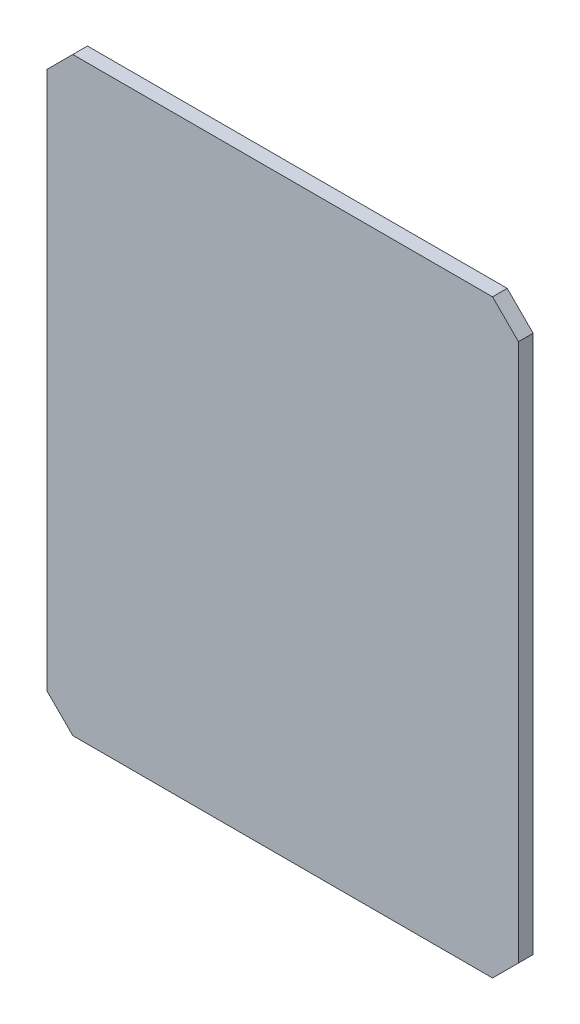
ISO-10303-21;
HEADER;
FILE_DESCRIPTION(('STEP AP214'),'2;1');
FILE_NAME('part.step','',(''),(''),'','','');
FILE_SCHEMA(('AUTOMOTIVE_DESIGN { 1 0 10303 214 1 1 1 1 }'));
ENDSEC;
DATA;
#1=APPLICATION_CONTEXT('core data for automotive mechanical design processes');
#2=APPLICATION_PROTOCOL_DEFINITION('international standard','automotive_design',2000,#1);
#3=PRODUCT_CONTEXT('',#1,'mechanical');
#4=PRODUCT('Part','Part','',(#3));
#5=PRODUCT_RELATED_PRODUCT_CATEGORY('part','',(#4));
#6=PRODUCT_DEFINITION_FORMATION('','',#4);
#7=PRODUCT_DEFINITION_CONTEXT('part definition',#1,'design');
#8=PRODUCT_DEFINITION('design','',#6,#7);
#9=PRODUCT_DEFINITION_SHAPE('','',#8);
#10=(LENGTH_UNIT() NAMED_UNIT(*) SI_UNIT(.MILLI.,.METRE.));
#11=(NAMED_UNIT(*) PLANE_ANGLE_UNIT() SI_UNIT($,.RADIAN.));
#12=(NAMED_UNIT(*) SI_UNIT($,.STERADIAN.) SOLID_ANGLE_UNIT());
#13=UNCERTAINTY_MEASURE_WITH_UNIT(LENGTH_MEASURE(1.E-05),#10,'distance_accuracy_value','');
#14=(GEOMETRIC_REPRESENTATION_CONTEXT(3) GLOBAL_UNCERTAINTY_ASSIGNED_CONTEXT((#13)) GLOBAL_UNIT_ASSIGNED_CONTEXT((#10,
#11,#12)) REPRESENTATION_CONTEXT('',''));
#15=CARTESIAN_POINT('',(0.,0.,0.));
#16=DIRECTION('',(0.,0.,1.));
#17=DIRECTION('',(1.,0.,0.));
#18=AXIS2_PLACEMENT_3D('',#15,#16,#17);
#19=CARTESIAN_POINT('',(273.,30.,17.));
#20=DIRECTION('',(-1.,0.,0.));
#21=DIRECTION('',(0.,0.,1.));
#22=AXIS2_PLACEMENT_3D('',#19,#20,#21);
#23=PLANE('',#22);
#24=DIRECTION('',(0.,1.,0.));
#25=VECTOR('',#24,1.);
#26=CARTESIAN_POINT('',(273.,30.,0.));
#27=LINE('',#26,#25);
#28=CARTESIAN_POINT('',(273.,60.,0.));
#29=VERTEX_POINT('',#28);
#30=CARTESIAN_POINT('',(273.,683.,0.));
#31=VERTEX_POINT('',#30);
#32=EDGE_CURVE('E112',#29,#31,#27,.T.);
#33=ORIENTED_EDGE('',*,*,#32,.T.);
#34=DIRECTION('',(0.,0.,1.));
#35=VECTOR('',#34,1.);
#36=CARTESIAN_POINT('',(273.,683.,17.));
#37=LINE('',#36,#35);
#38=CARTESIAN_POINT('',(273.,683.,17.));
#39=VERTEX_POINT('',#38);
#40=EDGE_CURVE('E135',#31,#39,#37,.T.);
#41=ORIENTED_EDGE('',*,*,#40,.T.);
#42=DIRECTION('',(0.,1.,0.));
#43=VECTOR('',#42,1.);
#44=CARTESIAN_POINT('',(273.,30.,17.));
#45=LINE('',#44,#43);
#46=CARTESIAN_POINT('',(273.,60.,17.));
#47=VERTEX_POINT('',#46);
#48=EDGE_CURVE('E110',#47,#39,#45,.T.);
#49=ORIENTED_EDGE('',*,*,#48,.F.);
#50=DIRECTION('',(0.,0.,-1.));
#51=VECTOR('',#50,1.);
#52=CARTESIAN_POINT('',(273.,60.,17.));
#53=LINE('',#52,#51);
#54=EDGE_CURVE('E132',#47,#29,#53,.T.);
#55=ORIENTED_EDGE('',*,*,#54,.T.);
#56=EDGE_LOOP('',(#33,#41,#49,#55));
#57=FACE_BOUND('',#56,.T.);
#58=ADVANCED_FACE('F17',(#57),#23,.F.);
#59=CARTESIAN_POINT('',(273.,713.,17.));
#60=DIRECTION('',(0.,-1.,0.));
#61=DIRECTION('',(1.,0.,0.));
#62=AXIS2_PLACEMENT_3D('',#59,#60,#61);
#63=PLANE('',#62);
#64=DIRECTION('',(-1.,0.,0.));
#65=VECTOR('',#64,1.);
#66=CARTESIAN_POINT('',(273.,713.,0.));
#67=LINE('',#66,#65);
#68=CARTESIAN_POINT('',(243.,713.,0.));
#69=VERTEX_POINT('',#68);
#70=CARTESIAN_POINT('',(-243.,713.,0.));
#71=VERTEX_POINT('',#70);
#72=EDGE_CURVE('E108',#69,#71,#67,.T.);
#73=ORIENTED_EDGE('',*,*,#72,.T.);
#74=DIRECTION('',(0.,0.,1.));
#75=VECTOR('',#74,1.);
#76=CARTESIAN_POINT('',(-243.,713.,17.));
#77=LINE('',#76,#75);
#78=CARTESIAN_POINT('',(-243.,713.,17.));
#79=VERTEX_POINT('',#78);
#80=EDGE_CURVE('E87',#71,#79,#77,.T.);
#81=ORIENTED_EDGE('',*,*,#80,.T.);
#82=DIRECTION('',(-1.,0.,0.));
#83=VECTOR('',#82,1.);
#84=CARTESIAN_POINT('',(273.,713.,17.));
#85=LINE('',#84,#83);
#86=CARTESIAN_POINT('',(243.,713.,17.));
#87=VERTEX_POINT('',#86);
#88=EDGE_CURVE('E151',#87,#79,#85,.T.);
#89=ORIENTED_EDGE('',*,*,#88,.F.);
#90=DIRECTION('',(0.,0.,-1.));
#91=VECTOR('',#90,1.);
#92=CARTESIAN_POINT('',(243.,713.,17.));
#93=LINE('',#92,#91);
#94=EDGE_CURVE('E92',#87,#69,#93,.T.);
#95=ORIENTED_EDGE('',*,*,#94,.T.);
#96=EDGE_LOOP('',(#73,#81,#89,#95));
#97=FACE_BOUND('',#96,.T.);
#98=ADVANCED_FACE('F170',(#97),#63,.F.);
#99=CARTESIAN_POINT('',(-273.,30.,17.));
#100=DIRECTION('',(1.,0.,0.));
#101=DIRECTION('',(0.,0.,-1.));
#102=AXIS2_PLACEMENT_3D('',#99,#100,#101);
#103=PLANE('',#102);
#104=DIRECTION('',(0.,-1.,0.));
#105=VECTOR('',#104,1.);
#106=CARTESIAN_POINT('',(-273.,30.,17.));
#107=LINE('',#106,#105);
#108=CARTESIAN_POINT('',(-273.,683.,17.));
#109=VERTEX_POINT('',#108);
#110=CARTESIAN_POINT('',(-273.,60.,17.));
#111=VERTEX_POINT('',#110);
#112=EDGE_CURVE('E101',#109,#111,#107,.T.);
#113=ORIENTED_EDGE('',*,*,#112,.F.);
#114=DIRECTION('',(0.,0.,-1.));
#115=VECTOR('',#114,1.);
#116=CARTESIAN_POINT('',(-273.,683.,17.));
#117=LINE('',#116,#115);
#118=CARTESIAN_POINT('',(-273.,683.,0.));
#119=VERTEX_POINT('',#118);
#120=EDGE_CURVE('E86',#109,#119,#117,.T.);
#121=ORIENTED_EDGE('',*,*,#120,.T.);
#122=DIRECTION('',(0.,-1.,0.));
#123=VECTOR('',#122,1.);
#124=CARTESIAN_POINT('',(-273.,30.,0.));
#125=LINE('',#124,#123);
#126=CARTESIAN_POINT('',(-273.,60.,0.));
#127=VERTEX_POINT('',#126);
#128=EDGE_CURVE('E99',#119,#127,#125,.T.);
#129=ORIENTED_EDGE('',*,*,#128,.T.);
#130=DIRECTION('',(0.,0.,1.));
#131=VECTOR('',#130,1.);
#132=CARTESIAN_POINT('',(-273.,60.,17.));
#133=LINE('',#132,#131);
#134=EDGE_CURVE('E103',#127,#111,#133,.T.);
#135=ORIENTED_EDGE('',*,*,#134,.T.);
#136=EDGE_LOOP('',(#113,#121,#129,#135));
#137=FACE_BOUND('',#136,.T.);
#138=ADVANCED_FACE('F98',(#137),#103,.F.);
#139=CARTESIAN_POINT('',(273.,30.,17.));
#140=DIRECTION('',(0.,1.,0.));
#141=DIRECTION('',(-1.,0.,0.));
#142=AXIS2_PLACEMENT_3D('',#139,#140,#141);
#143=PLANE('',#142);
#144=DIRECTION('',(1.,0.,0.));
#145=VECTOR('',#144,1.);
#146=CARTESIAN_POINT('',(273.,30.,0.));
#147=LINE('',#146,#145);
#148=CARTESIAN_POINT('',(-243.,30.,0.));
#149=VERTEX_POINT('',#148);
#150=CARTESIAN_POINT('',(243.,30.,0.));
#151=VERTEX_POINT('',#150);
#152=EDGE_CURVE('E107',#149,#151,#147,.T.);
#153=ORIENTED_EDGE('',*,*,#152,.T.);
#154=DIRECTION('',(0.,0.,1.));
#155=VECTOR('',#154,1.);
#156=CARTESIAN_POINT('',(243.,30.,17.));
#157=LINE('',#156,#155);
#158=CARTESIAN_POINT('',(243.,30.,17.));
#159=VERTEX_POINT('',#158);
#160=EDGE_CURVE('E11',#151,#159,#157,.T.);
#161=ORIENTED_EDGE('',*,*,#160,.T.);
#162=DIRECTION('',(1.,0.,0.));
#163=VECTOR('',#162,1.);
#164=CARTESIAN_POINT('',(273.,30.,17.));
#165=LINE('',#164,#163);
#166=CARTESIAN_POINT('',(-243.,30.,17.));
#167=VERTEX_POINT('',#166);
#168=EDGE_CURVE('E116',#167,#159,#165,.T.);
#169=ORIENTED_EDGE('',*,*,#168,.F.);
#170=DIRECTION('',(0.,0.,-1.));
#171=VECTOR('',#170,1.);
#172=CARTESIAN_POINT('',(-243.,30.,17.));
#173=LINE('',#172,#171);
#174=EDGE_CURVE('E25',#167,#149,#173,.T.);
#175=ORIENTED_EDGE('',*,*,#174,.T.);
#176=EDGE_LOOP('',(#153,#161,#169,#175));
#177=FACE_BOUND('',#176,.T.);
#178=ADVANCED_FACE('F138',(#177),#143,.F.);
#179=CARTESIAN_POINT('',(0.,0.,17.));
#180=DIRECTION('',(0.,0.,1.));
#181=DIRECTION('',(1.,0.,0.));
#182=AXIS2_PLACEMENT_3D('',#179,#180,#181);
#183=PLANE('',#182);
#184=ORIENTED_EDGE('',*,*,#88,.T.);
#185=DIRECTION('',(0.707106781186549,0.707106781186546,0.));
#186=VECTOR('',#185,1.);
#187=CARTESIAN_POINT('',(-478.,478.,17.));
#188=LINE('',#187,#186);
#189=EDGE_CURVE('E130',#79,#109,#188,.F.);
#190=ORIENTED_EDGE('',*,*,#189,.T.);
#191=ORIENTED_EDGE('',*,*,#112,.T.);
#192=DIRECTION('',(-0.707106781186546,0.707106781186549,0.));
#193=VECTOR('',#192,1.);
#194=CARTESIAN_POINT('',(-106.5,-106.5,17.));
#195=LINE('',#194,#193);
#196=EDGE_CURVE('E37',#111,#167,#195,.F.);
#197=ORIENTED_EDGE('',*,*,#196,.T.);
#198=ORIENTED_EDGE('',*,*,#168,.T.);
#199=DIRECTION('',(-0.707106781186549,-0.707106781186546,0.));
#200=VECTOR('',#199,1.);
#201=CARTESIAN_POINT('',(106.5,-106.5,17.));
#202=LINE('',#201,#200);
#203=EDGE_CURVE('E126',#159,#47,#202,.F.);
#204=ORIENTED_EDGE('',*,*,#203,.T.);
#205=ORIENTED_EDGE('',*,*,#48,.T.);
#206=DIRECTION('',(0.707106781186548,-0.707106781186548,0.));
#207=VECTOR('',#206,1.);
#208=CARTESIAN_POINT('',(478.,478.,17.));
#209=LINE('',#208,#207);
#210=EDGE_CURVE('E128',#39,#87,#209,.F.);
#211=ORIENTED_EDGE('',*,*,#210,.T.);
#212=EDGE_LOOP('',(#184,#190,#191,#197,#198,#204,#205,#211));
#213=FACE_BOUND('',#212,.T.);
#214=ADVANCED_FACE('F157',(#213),#183,.T.);
#215=CARTESIAN_POINT('',(0.,0.,0.));
#216=DIRECTION('',(0.,0.,1.));
#217=DIRECTION('',(1.,0.,0.));
#218=AXIS2_PLACEMENT_3D('',#215,#216,#217);
#219=PLANE('',#218);
#220=ORIENTED_EDGE('',*,*,#128,.F.);
#221=DIRECTION('',(-0.707106781186549,-0.707106781186546,0.));
#222=VECTOR('',#221,1.);
#223=CARTESIAN_POINT('',(-273.,683.,0.));
#224=LINE('',#223,#222);
#225=EDGE_CURVE('E82',#119,#71,#224,.F.);
#226=ORIENTED_EDGE('',*,*,#225,.T.);
#227=ORIENTED_EDGE('',*,*,#72,.F.);
#228=DIRECTION('',(-0.707106781186548,0.707106781186548,0.));
#229=VECTOR('',#228,1.);
#230=CARTESIAN_POINT('',(243.,713.,0.));
#231=LINE('',#230,#229);
#232=EDGE_CURVE('E93',#69,#31,#231,.F.);
#233=ORIENTED_EDGE('',*,*,#232,.T.);
#234=ORIENTED_EDGE('',*,*,#32,.F.);
#235=DIRECTION('',(0.707106781186549,0.707106781186546,0.));
#236=VECTOR('',#235,1.);
#237=CARTESIAN_POINT('',(273.,60.,0.));
#238=LINE('',#237,#236);
#239=EDGE_CURVE('E119',#29,#151,#238,.F.);
#240=ORIENTED_EDGE('',*,*,#239,.T.);
#241=ORIENTED_EDGE('',*,*,#152,.F.);
#242=DIRECTION('',(0.707106781186546,-0.707106781186549,0.));
#243=VECTOR('',#242,1.);
#244=CARTESIAN_POINT('',(-243.,30.,0.));
#245=LINE('',#244,#243);
#246=EDGE_CURVE('E102',#149,#127,#245,.F.);
#247=ORIENTED_EDGE('',*,*,#246,.T.);
#248=EDGE_LOOP('',(#220,#226,#227,#233,#234,#240,#241,#247));
#249=FACE_BOUND('',#248,.T.);
#250=ADVANCED_FACE('F105',(#249),#219,.F.);
#251=CARTESIAN_POINT('',(-273.,683.,17.));
#252=DIRECTION('',(0.707106781186546,-0.707106781186549,0.));
#253=DIRECTION('',(0.,0.,-1.));
#254=AXIS2_PLACEMENT_3D('',#251,#252,#253);
#255=PLANE('',#254);
#256=ORIENTED_EDGE('',*,*,#189,.F.);
#257=ORIENTED_EDGE('',*,*,#80,.F.);
#258=ORIENTED_EDGE('',*,*,#225,.F.);
#259=ORIENTED_EDGE('',*,*,#120,.F.);
#260=EDGE_LOOP('',(#256,#257,#258,#259));
#261=FACE_BOUND('',#260,.T.);
#262=ADVANCED_FACE('F85',(#261),#255,.F.);
#263=CARTESIAN_POINT('',(243.,713.,17.));
#264=DIRECTION('',(-0.707106781186548,-0.707106781186548,0.));
#265=DIRECTION('',(0.,0.,-1.));
#266=AXIS2_PLACEMENT_3D('',#263,#264,#265);
#267=PLANE('',#266);
#268=ORIENTED_EDGE('',*,*,#210,.F.);
#269=ORIENTED_EDGE('',*,*,#40,.F.);
#270=ORIENTED_EDGE('',*,*,#232,.F.);
#271=ORIENTED_EDGE('',*,*,#94,.F.);
#272=EDGE_LOOP('',(#268,#269,#270,#271));
#273=FACE_BOUND('',#272,.T.);
#274=ADVANCED_FACE('F182',(#273),#267,.F.);
#275=CARTESIAN_POINT('',(273.,60.,17.));
#276=DIRECTION('',(-0.707106781186546,0.707106781186549,0.));
#277=DIRECTION('',(0.,0.,-1.));
#278=AXIS2_PLACEMENT_3D('',#275,#276,#277);
#279=PLANE('',#278);
#280=ORIENTED_EDGE('',*,*,#203,.F.);
#281=ORIENTED_EDGE('',*,*,#160,.F.);
#282=ORIENTED_EDGE('',*,*,#239,.F.);
#283=ORIENTED_EDGE('',*,*,#54,.F.);
#284=EDGE_LOOP('',(#280,#281,#282,#283));
#285=FACE_BOUND('',#284,.T.);
#286=ADVANCED_FACE('F145',(#285),#279,.F.);
#287=CARTESIAN_POINT('',(-243.,30.,17.));
#288=DIRECTION('',(0.707106781186549,0.707106781186546,0.));
#289=DIRECTION('',(0.,0.,-1.));
#290=AXIS2_PLACEMENT_3D('',#287,#288,#289);
#291=PLANE('',#290);
#292=ORIENTED_EDGE('',*,*,#196,.F.);
#293=ORIENTED_EDGE('',*,*,#134,.F.);
#294=ORIENTED_EDGE('',*,*,#246,.F.);
#295=ORIENTED_EDGE('',*,*,#174,.F.);
#296=EDGE_LOOP('',(#292,#293,#294,#295));
#297=FACE_BOUND('',#296,.T.);
#298=ADVANCED_FACE('F19',(#297),#291,.F.);
#299=CLOSED_SHELL('',(#58,#98,#138,#178,#214,#250,#262,#274,#286,#298));
#300=MANIFOLD_SOLID_BREP('B1',#299);
#301=ADVANCED_BREP_SHAPE_REPRESENTATION('',(#18,#300),#14);
#302=SHAPE_DEFINITION_REPRESENTATION(#9,#301);
ENDSEC;
END-ISO-10303-21;
